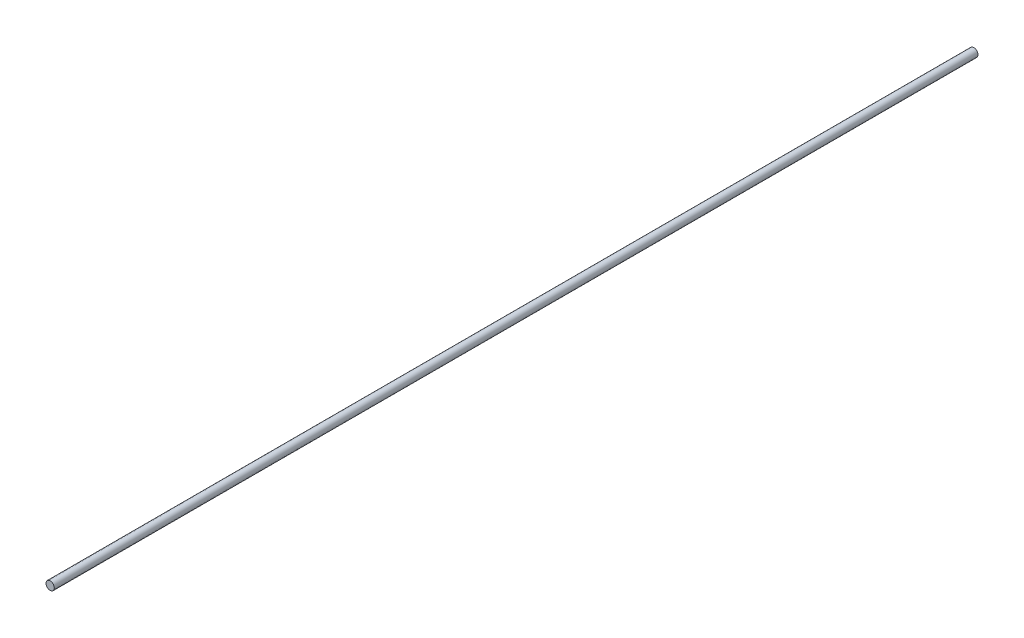
ISO-10303-21;
HEADER;
FILE_DESCRIPTION(('STEP AP214'),'2;1');
FILE_NAME('part.step','',(''),(''),'','','');
FILE_SCHEMA(('AUTOMOTIVE_DESIGN { 1 0 10303 214 1 1 1 1 }'));
ENDSEC;
DATA;
#1=APPLICATION_CONTEXT('core data for automotive mechanical design processes');
#2=APPLICATION_PROTOCOL_DEFINITION('international standard','automotive_design',2000,#1);
#3=PRODUCT_CONTEXT('',#1,'mechanical');
#4=PRODUCT('Part','Part','',(#3));
#5=PRODUCT_RELATED_PRODUCT_CATEGORY('part','',(#4));
#6=PRODUCT_DEFINITION_FORMATION('','',#4);
#7=PRODUCT_DEFINITION_CONTEXT('part definition',#1,'design');
#8=PRODUCT_DEFINITION('design','',#6,#7);
#9=PRODUCT_DEFINITION_SHAPE('','',#8);
#10=(LENGTH_UNIT() NAMED_UNIT(*) SI_UNIT(.MILLI.,.METRE.));
#11=(NAMED_UNIT(*) PLANE_ANGLE_UNIT() SI_UNIT($,.RADIAN.));
#12=(NAMED_UNIT(*) SI_UNIT($,.STERADIAN.) SOLID_ANGLE_UNIT());
#13=UNCERTAINTY_MEASURE_WITH_UNIT(LENGTH_MEASURE(1.E-05),#10,'distance_accuracy_value','');
#14=(GEOMETRIC_REPRESENTATION_CONTEXT(3) GLOBAL_UNCERTAINTY_ASSIGNED_CONTEXT((#13)) GLOBAL_UNIT_ASSIGNED_CONTEXT((#10,
#11,#12)) REPRESENTATION_CONTEXT('',''));
#15=CARTESIAN_POINT('',(0.,0.,0.));
#16=DIRECTION('',(0.,0.,1.));
#17=DIRECTION('',(1.,0.,0.));
#18=AXIS2_PLACEMENT_3D('',#15,#16,#17);
#19=CARTESIAN_POINT('',(0.,0.,200.));
#20=DIRECTION('',(0.,0.,-1.));
#21=DIRECTION('',(-1.,0.,0.));
#22=AXIS2_PLACEMENT_3D('',#19,#20,#21);
#23=CYLINDRICAL_SURFACE('',#22,0.9);
#24=CARTESIAN_POINT('',(0.,0.,200.));
#25=DIRECTION('',(0.,0.,1.));
#26=DIRECTION('',(1.,0.,0.));
#27=AXIS2_PLACEMENT_3D('',#24,#25,#26);
#28=CIRCLE('',#27,0.9);
#29=CARTESIAN_POINT('',(0.9,0.,200.));
#30=VERTEX_POINT('',#29);
#31=EDGE_CURVE('E10',#30,#30,#28,.T.);
#32=ORIENTED_EDGE('',*,*,#31,.F.);
#33=EDGE_LOOP('',(#32));
#34=FACE_BOUND('',#33,.T.);
#35=CARTESIAN_POINT('',(0.,0.,0.));
#36=DIRECTION('',(0.,0.,1.));
#37=DIRECTION('',(1.,0.,0.));
#38=AXIS2_PLACEMENT_3D('',#35,#36,#37);
#39=CIRCLE('',#38,0.9);
#40=CARTESIAN_POINT('',(0.9,0.,0.));
#41=VERTEX_POINT('',#40);
#42=EDGE_CURVE('E50',#41,#41,#39,.T.);
#43=ORIENTED_EDGE('',*,*,#42,.T.);
#44=EDGE_LOOP('',(#43));
#45=FACE_BOUND('',#44,.T.);
#46=ADVANCED_FACE('F47',(#34,#45),#23,.T.);
#47=CARTESIAN_POINT('',(0.,0.,200.));
#48=DIRECTION('',(0.,0.,1.));
#49=DIRECTION('',(1.,0.,0.));
#50=AXIS2_PLACEMENT_3D('',#47,#48,#49);
#51=PLANE('',#50);
#52=ORIENTED_EDGE('',*,*,#31,.T.);
#53=EDGE_LOOP('',(#52));
#54=FACE_BOUND('',#53,.T.);
#55=ADVANCED_FACE('F62',(#54),#51,.T.);
#56=CARTESIAN_POINT('',(0.,0.,0.));
#57=DIRECTION('',(0.,0.,1.));
#58=DIRECTION('',(1.,0.,0.));
#59=AXIS2_PLACEMENT_3D('',#56,#57,#58);
#60=PLANE('',#59);
#61=ORIENTED_EDGE('',*,*,#42,.F.);
#62=EDGE_LOOP('',(#61));
#63=FACE_BOUND('',#62,.T.);
#64=ADVANCED_FACE('F60',(#63),#60,.F.);
#65=CLOSED_SHELL('',(#46,#55,#64));
#66=MANIFOLD_SOLID_BREP('B2',#65);
#67=ADVANCED_BREP_SHAPE_REPRESENTATION('',(#18,#66),#14);
#68=SHAPE_DEFINITION_REPRESENTATION(#9,#67);
ENDSEC;
END-ISO-10303-21;
